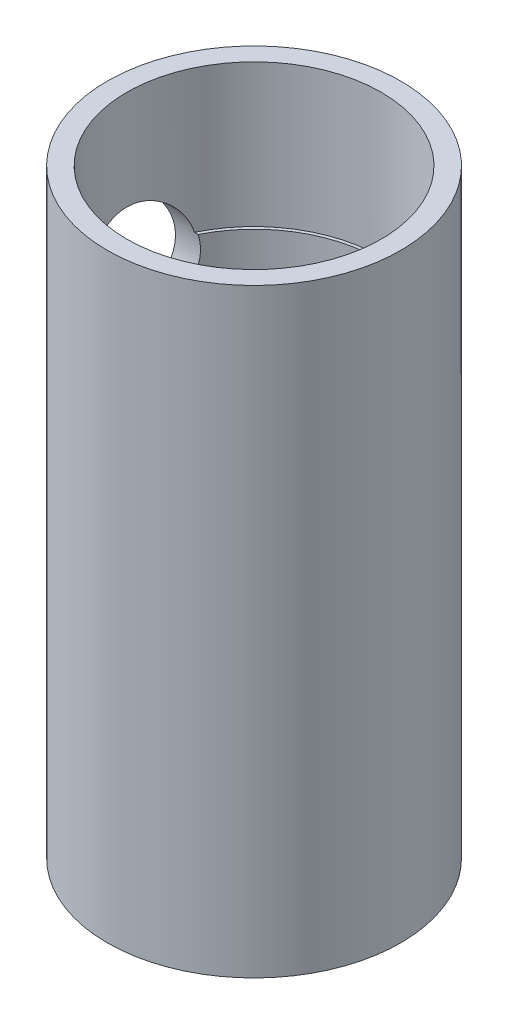
ISO-10303-21;
HEADER;
FILE_DESCRIPTION(('STEP AP214'),'2;1');
FILE_NAME('part.step','',(''),(''),'','','');
FILE_SCHEMA(('AUTOMOTIVE_DESIGN { 1 0 10303 214 1 1 1 1 }'));
ENDSEC;
DATA;
#1=APPLICATION_CONTEXT('core data for automotive mechanical design processes');
#2=APPLICATION_PROTOCOL_DEFINITION('international standard','automotive_design',2000,#1);
#3=PRODUCT_CONTEXT('',#1,'mechanical');
#4=PRODUCT('Part','Part','',(#3));
#5=PRODUCT_RELATED_PRODUCT_CATEGORY('part','',(#4));
#6=PRODUCT_DEFINITION_FORMATION('','',#4);
#7=PRODUCT_DEFINITION_CONTEXT('part definition',#1,'design');
#8=PRODUCT_DEFINITION('design','',#6,#7);
#9=PRODUCT_DEFINITION_SHAPE('','',#8);
#10=(LENGTH_UNIT() NAMED_UNIT(*) SI_UNIT(.MILLI.,.METRE.));
#11=(NAMED_UNIT(*) PLANE_ANGLE_UNIT() SI_UNIT($,.RADIAN.));
#12=(NAMED_UNIT(*) SI_UNIT($,.STERADIAN.) SOLID_ANGLE_UNIT());
#13=UNCERTAINTY_MEASURE_WITH_UNIT(LENGTH_MEASURE(1.E-05),#10,'distance_accuracy_value','');
#14=(GEOMETRIC_REPRESENTATION_CONTEXT(3) GLOBAL_UNCERTAINTY_ASSIGNED_CONTEXT((#13)) GLOBAL_UNIT_ASSIGNED_CONTEXT((#10,
#11,#12)) REPRESENTATION_CONTEXT('',''));
#15=CARTESIAN_POINT('',(0.,0.,0.));
#16=DIRECTION('',(0.,0.,1.));
#17=DIRECTION('',(1.,0.,0.));
#18=AXIS2_PLACEMENT_3D('',#15,#16,#17);
#19=CARTESIAN_POINT('',(0.,92.5,0.));
#20=DIRECTION('',(0.,-1.,0.));
#21=DIRECTION('',(0.,0.,-1.));
#22=AXIS2_PLACEMENT_3D('',#19,#20,#21);
#23=CYLINDRICAL_SURFACE('',#22,38.25);
#24=CARTESIAN_POINT('',(-34.2641941390718,48.5,17.0008088042893));
#25=CARTESIAN_POINT('',(-34.2381435848934,48.2849354779542,17.053307658475));
#26=CARTESIAN_POINT('',(-34.2139501900393,48.0686850927902,17.1017703815142));
#27=CARTESIAN_POINT('',(-34.1694481465527,47.6341120665675,17.1905149308626));
#28=CARTESIAN_POINT('',(-34.1491395748714,47.4157893845503,17.2307965951209));
#29=CARTESIAN_POINT('',(-34.0943033376247,46.7582367167698,17.3391939806238));
#30=CARTESIAN_POINT('',(-34.0658577161328,46.3163613613227,17.3948769432476));
#31=CARTESIAN_POINT('',(-34.0262278013022,45.4302944303113,17.4722693404018));
#32=CARTESIAN_POINT('',(-34.014990750002,44.9861141401189,17.4940826153484));
#33=CARTESIAN_POINT('',(-34.0099826794918,44.0973048101313,17.5038171775729));
#34=CARTESIAN_POINT('',(-34.016210190714,43.6526758112401,17.4917413164754));
#35=CARTESIAN_POINT('',(-34.0459345779966,42.765756573535,17.4338145053133));
#36=CARTESIAN_POINT('',(-34.0694491962198,42.3234692080585,17.3879288553609));
#37=CARTESIAN_POINT('',(-34.1329835449892,41.4448138791733,17.2628744296219));
#38=CARTESIAN_POINT('',(-34.1730042889734,41.0084462809243,17.1837036101966));
#39=CARTESIAN_POINT('',(-34.2682698028966,40.1445013582464,16.9929258414245));
#40=CARTESIAN_POINT('',(-34.3235170488628,39.7169254756272,16.8813136165217));
#41=CARTESIAN_POINT('',(-34.4475435978451,38.8732385977085,16.6267632834821));
#42=CARTESIAN_POINT('',(-34.5163230406553,38.4571277208988,16.4838248517285));
#43=CARTESIAN_POINT('',(-34.6667363889519,37.6315376158535,16.1651306656347));
#44=CARTESIAN_POINT('',(-34.7485727210965,37.2222989186612,15.9888482766277));
#45=CARTESIAN_POINT('',(-34.9219725410941,36.4199828887646,15.6064856014758));
#46=CARTESIAN_POINT('',(-35.0135392965897,36.0269110470224,15.4003952968805));
#47=CARTESIAN_POINT('',(-35.2040516835182,35.2587246783528,14.9597746127656));
#48=CARTESIAN_POINT('',(-35.3030001278675,34.8836170873327,14.7252333700046));
#49=CARTESIAN_POINT('',(-35.5058567589881,34.1531122381153,14.2291408484609));
#50=CARTESIAN_POINT('',(-35.6097652864978,33.7977163376698,13.9675877126269));
#51=CARTESIAN_POINT('',(-35.8311275063851,33.0722049803065,13.3902222747479));
#52=CARTESIAN_POINT('',(-35.9488648585861,32.7044111751399,13.0715960042441));
#53=CARTESIAN_POINT('',(-36.1843046752592,31.9967524573306,12.4049785893923));
#54=CARTESIAN_POINT('',(-36.3020071366213,31.6568773143975,12.0569982968926));
#55=CARTESIAN_POINT('',(-36.5344607320918,31.00658966723,11.3331480999331));
#56=CARTESIAN_POINT('',(-36.6492098810396,30.6961966217081,10.9572600634305));
#57=CARTESIAN_POINT('',(-36.8726927520938,30.1072056144364,10.179907041982));
#58=CARTESIAN_POINT('',(-36.9814288725541,29.8285949281678,9.77845239401758));
#59=CARTESIAN_POINT('',(-37.1938647235533,29.2956674646876,8.9372107724763));
#60=CARTESIAN_POINT('',(-37.2972460232827,29.042573234301,8.49656694811337));
#61=CARTESIAN_POINT('',(-37.4916875416269,28.5747212242354,7.59272813345202));
#62=CARTESIAN_POINT('',(-37.5827473129546,28.3599648361779,7.12953232531777));
#63=CARTESIAN_POINT('',(-37.7498444293093,27.9710781432407,6.18401797061164));
#64=CARTESIAN_POINT('',(-37.8258891329526,27.7969279303925,5.70170893094741));
#65=CARTESIAN_POINT('',(-37.9607035929183,27.4911335297655,4.72145580067361));
#66=CARTESIAN_POINT('',(-38.0194749640292,27.3594853685916,4.22351317638151));
#67=CARTESIAN_POINT('',(-38.1143676489956,27.1482341474891,3.25240313375543));
#68=CARTESIAN_POINT('',(-38.1518140468948,27.0655687515312,2.78002976803506));
#69=CARTESIAN_POINT('',(-38.2092129443408,26.9392378759796,1.82904354982571));
#70=CARTESIAN_POINT('',(-38.2291662712299,26.8955705519537,1.3504309935086));
#71=CARTESIAN_POINT('',(-38.2510106768318,26.8477782069746,0.39098625475133));
#72=CARTESIAN_POINT('',(-38.2529078172102,26.8436399156774,-0.0898451285645744));
#73=CARTESIAN_POINT('',(-38.2386008057896,26.8749237012639,-1.0499393157405));
#74=CARTESIAN_POINT('',(-38.2223972591985,26.910344455466,-1.52920217150788));
#75=CARTESIAN_POINT('',(-38.1739532384048,27.0167870428658,-2.45182127379952));
#76=CARTESIAN_POINT('',(-38.1428025818588,27.0853917843811,-2.89551656590489));
#77=CARTESIAN_POINT('',(-38.0658137103129,27.2561566037183,-3.77507582412566));
#78=CARTESIAN_POINT('',(-38.0199762702756,27.3583149110602,-4.21094020216573));
#79=CARTESIAN_POINT('',(-37.9147055894478,27.5951903216102,-5.07205990229719));
#80=CARTESIAN_POINT('',(-37.8552714777882,27.7299095103793,-5.49731454289734));
#81=CARTESIAN_POINT('',(-37.724187426682,28.0306823545084,-6.33465028591056));
#82=CARTESIAN_POINT('',(-37.65253701193,28.1967372290869,-6.74673087501375));
#83=CARTESIAN_POINT('',(-37.4963864340642,28.5640906181402,-7.56722906376009));
#84=CARTESIAN_POINT('',(-37.4115726593048,28.7662751614723,-7.97518997425803));
#85=CARTESIAN_POINT('',(-37.2326667858936,29.200803038743,-8.77257159703507));
#86=CARTESIAN_POINT('',(-37.1385745884722,29.4331466937363,-9.1619921118847));
#87=CARTESIAN_POINT('',(-36.9432040768317,29.9264386839699,-9.920462389794));
#88=CARTESIAN_POINT('',(-36.8419244682634,30.1873921760634,-10.2895084623263));
#89=CARTESIAN_POINT('',(-36.6343879472974,30.7363862271596,-11.0055969343031));
#90=CARTESIAN_POINT('',(-36.5281291107501,31.0244373016776,-11.3526307034381));
#91=CARTESIAN_POINT('',(-36.3038844379294,31.6514822562194,-12.0514007554351));
#92=CARTESIAN_POINT('',(-36.185667327808,31.9927243815419,-12.4010483415857));
#93=CARTESIAN_POINT('',(-35.9492358333471,32.7032290000104,-13.0706172093886));
#94=CARTESIAN_POINT('',(-35.8310214491907,33.0724923188239,-13.3905376144867));
#95=CARTESIAN_POINT('',(-35.5977296042384,33.8372236754821,-13.9989407114712));
#96=CARTESIAN_POINT('',(-35.4826531892806,34.2327003027419,-14.2874130159301));
#97=CARTESIAN_POINT('',(-35.2589048929774,35.047772414233,-14.8309997173997));
#98=CARTESIAN_POINT('',(-35.1502339838505,35.4673715407497,-15.0861090577515));
#99=CARTESIAN_POINT('',(-34.9393673629489,36.3417321055678,-15.5683824467248));
#100=CARTESIAN_POINT('',(-34.8374756303952,36.7971795166681,-15.7944389557166));
#101=CARTESIAN_POINT('',(-34.6475454313125,37.7282604543039,-16.2068398948384));
#102=CARTESIAN_POINT('',(-34.5595003893526,38.2038842625157,-16.3932031892248));
#103=CARTESIAN_POINT('',(-34.4005134627231,39.1720921357527,-16.7242618329952));
#104=CARTESIAN_POINT('',(-34.3295671598624,39.6646717818354,-16.8689679481781));
#105=CARTESIAN_POINT('',(-34.2076240679525,40.6629581013979,-17.1149020294832));
#106=CARTESIAN_POINT('',(-34.1566241234102,41.1686626850171,-17.2161368729638));
#107=CARTESIAN_POINT('',(-34.0801897971872,42.1448103002928,-17.3669123065925));
#108=CARTESIAN_POINT('',(-34.0529327501744,42.6145418657875,-17.4201523652447));
#109=CARTESIAN_POINT('',(-34.0179144579244,43.5575658098823,-17.4884391329691));
#110=CARTESIAN_POINT('',(-34.010154879679,44.0308584894805,-17.5034825763138));
#111=CARTESIAN_POINT('',(-34.0144311694162,44.9762367631149,-17.495170153445));
#112=CARTESIAN_POINT('',(-34.0264355124444,45.4483230788278,-17.4718754395241));
#113=CARTESIAN_POINT('',(-34.0697198385377,46.3879762786799,-17.3873217187934));
#114=CARTESIAN_POINT('',(-34.100988510702,46.8555456514072,-17.3260849892227));
#115=CARTESIAN_POINT('',(-34.1585584494719,47.5176350763709,-17.2121116657303));
#116=CARTESIAN_POINT('',(-34.1774908392059,47.7155312439865,-17.1745079542443));
#117=CARTESIAN_POINT('',(-34.2185092300184,48.1092723068575,-17.0926362884327));
#118=CARTESIAN_POINT('',(-34.2405900559208,48.3051200131082,-17.0483792639901));
#119=CARTESIAN_POINT('',(-34.2641941390718,48.5,-17.0008088042893));
#120=B_SPLINE_CURVE_WITH_KNOTS('',3,(#24,#25,#26,#27,#28,#29,#30,#31,#32,#33,#34,#35,#36,#37,
#38,#39,#40,#41,#42,#43,#44,#45,#46,#47,#48,#49,#50,#51,#52,#53,#54,#55,#56,#57,#58,#59,#60,#61,
#62,#63,#64,#65,#66,#67,#68,#69,#70,#71,#72,#73,#74,#75,#76,#77,#78,#79,#80,#81,#82,#83,#84,#85,
#86,#87,#88,#89,#90,#91,#92,#93,#94,#95,#96,#97,#98,#99,#100,#101,#102,#103,#104,#105,#106,#107,
#108,#109,#110,#111,#112,#113,#114,#115,#116,#117,#118,#119),.UNSPECIFIED.,.F.,.F.,(4,2,2,2,2,2,
2,2,2,2,2,2,2,2,2,2,2,2,2,2,2,2,2,2,2,2,2,2,2,2,2,2,2,2,2,2,2,2,2,2,2,2,2,2,2,2,2,4),(0.,
0.668624185006783,1.33726161285922,2.67434813861644,4.00732716524454,5.34019403079537,
6.67443076194051,8.00874942435118,9.34328519247991,10.6778347477381,12.0355522387374,
13.3937271240389,14.7524222346864,16.11121081706,17.6115088712097,19.1112546927625,
20.6119835934538,22.1121095314822,23.6657956600238,25.2195381742038,26.7725173265876,
28.3253512533266,29.7664959521713,31.207572487785,32.6481652206734,34.0887097878787,
35.4372914295982,36.7858019237924,38.1343988145036,39.483048187664,40.8709989422968,
42.2589644733725,43.6471805944283,45.0359376679571,46.5422543513417,48.0486154368329,
49.5554725811596,51.0625578483159,52.6162275358085,54.1691571838055,55.7216851347007,
57.2739673778463,58.692640322139,60.1114345557986,61.5279678967541,62.943670322774,
63.550528057953,64.1563995427988),.UNSPECIFIED.);
#121=CARTESIAN_POINT('',(-34.2641941390718,48.5,17.0008088042893));
#122=VERTEX_POINT('',#121);
#123=CARTESIAN_POINT('',(-34.2641941390718,48.5,-17.0008088042893));
#124=VERTEX_POINT('',#123);
#125=EDGE_CURVE('E54',#122,#124,#120,.T.);
#126=ORIENTED_EDGE('',*,*,#125,.F.);
#127=CARTESIAN_POINT('',(0.,48.5,0.));
#128=DIRECTION('',(0.,1.,0.));
#129=DIRECTION('',(0.,0.,1.));
#130=AXIS2_PLACEMENT_3D('',#127,#128,#129);
#131=CIRCLE('',#130,38.25);
#132=EDGE_CURVE('E85',#122,#124,#131,.T.);
#133=ORIENTED_EDGE('',*,*,#132,.T.);
#134=EDGE_LOOP('',(#126,#133));
#135=FACE_BOUND('',#134,.T.);
#136=CARTESIAN_POINT('',(0.,13.85,0.));
#137=DIRECTION('',(0.,-1.,0.));
#138=DIRECTION('',(0.,0.,-1.));
#139=AXIS2_PLACEMENT_3D('',#136,#137,#138);
#140=CIRCLE('',#139,38.25);
#141=CARTESIAN_POINT('',(0.,13.85,-38.25));
#142=VERTEX_POINT('',#141);
#143=EDGE_CURVE('E91',#142,#142,#140,.T.);
#144=ORIENTED_EDGE('',*,*,#143,.T.);
#145=EDGE_LOOP('',(#144));
#146=FACE_BOUND('',#145,.T.);
#147=ADVANCED_FACE('F39',(#135,#146),#23,.F.);
#148=CARTESIAN_POINT('',(0.,92.5,0.));
#149=DIRECTION('',(0.,1.,0.));
#150=DIRECTION('',(0.,0.,1.));
#151=AXIS2_PLACEMENT_3D('',#148,#149,#150);
#152=PLANE('',#151);
#153=CARTESIAN_POINT('',(0.,92.5,0.));
#154=DIRECTION('',(0.,1.,0.));
#155=DIRECTION('',(0.,0.,1.));
#156=AXIS2_PLACEMENT_3D('',#153,#154,#155);
#157=CIRCLE('',#156,39.25);
#158=CARTESIAN_POINT('',(0.,92.5,39.25));
#159=VERTEX_POINT('',#158);
#160=EDGE_CURVE('E79',#159,#159,#157,.T.);
#161=ORIENTED_EDGE('',*,*,#160,.F.);
#162=EDGE_LOOP('',(#161));
#163=FACE_BOUND('',#162,.T.);
#164=CARTESIAN_POINT('',(0.,92.5,0.));
#165=DIRECTION('',(0.,1.,0.));
#166=DIRECTION('',(0.,0.,1.));
#167=AXIS2_PLACEMENT_3D('',#164,#165,#166);
#168=CIRCLE('',#167,45.25);
#169=CARTESIAN_POINT('',(0.,92.5,45.25));
#170=VERTEX_POINT('',#169);
#171=EDGE_CURVE('E99',#170,#170,#168,.T.);
#172=ORIENTED_EDGE('',*,*,#171,.T.);
#173=EDGE_LOOP('',(#172));
#174=FACE_BOUND('',#173,.T.);
#175=ADVANCED_FACE('F118',(#163,#174),#152,.T.);
#176=CARTESIAN_POINT('',(0.,-92.5,0.));
#177=DIRECTION('',(0.,1.,0.));
#178=DIRECTION('',(0.,0.,1.));
#179=AXIS2_PLACEMENT_3D('',#176,#177,#178);
#180=PLANE('',#179);
#181=CARTESIAN_POINT('',(0.,-92.5,0.));
#182=DIRECTION('',(0.,1.,0.));
#183=DIRECTION('',(0.,0.,1.));
#184=AXIS2_PLACEMENT_3D('',#181,#182,#183);
#185=CIRCLE('',#184,45.25);
#186=CARTESIAN_POINT('',(0.,-92.5,45.25));
#187=VERTEX_POINT('',#186);
#188=EDGE_CURVE('E98',#187,#187,#185,.T.);
#189=ORIENTED_EDGE('',*,*,#188,.F.);
#190=EDGE_LOOP('',(#189));
#191=FACE_BOUND('',#190,.T.);
#192=CARTESIAN_POINT('',(0.,-92.5,0.));
#193=DIRECTION('',(0.,1.,0.));
#194=DIRECTION('',(0.,0.,1.));
#195=AXIS2_PLACEMENT_3D('',#192,#193,#194);
#196=CIRCLE('',#195,38.25);
#197=CARTESIAN_POINT('',(0.,-92.5,38.25));
#198=VERTEX_POINT('',#197);
#199=EDGE_CURVE('E95',#198,#198,#196,.T.);
#200=ORIENTED_EDGE('',*,*,#199,.T.);
#201=EDGE_LOOP('',(#200));
#202=FACE_BOUND('',#201,.T.);
#203=ADVANCED_FACE('F116',(#191,#202),#180,.F.);
#204=CARTESIAN_POINT('',(0.,92.5,0.));
#205=DIRECTION('',(0.,-1.,0.));
#206=DIRECTION('',(0.,0.,-1.));
#207=AXIS2_PLACEMENT_3D('',#204,#205,#206);
#208=CYLINDRICAL_SURFACE('',#207,45.25);
#209=CARTESIAN_POINT('',(-45.25,26.85,0.));
#210=CARTESIAN_POINT('',(-45.2500021885297,26.8499970724663,-0.472775029653615));
#211=CARTESIAN_POINT('',(-45.2425750329907,26.8691727907454,-0.945511062382879));
#212=CARTESIAN_POINT('',(-45.2130752570356,26.9456631794411,-1.88739038742202));
#213=CARTESIAN_POINT('',(-45.1910042238609,27.002973716449,-2.35653406353131));
#214=CARTESIAN_POINT('',(-45.1328171267814,27.1551284872674,-3.2876927777358));
#215=CARTESIAN_POINT('',(-45.0967040093148,27.2499648471411,-3.74970929018704));
#216=CARTESIAN_POINT('',(-45.0113901039774,27.4762419479669,-4.66345749003758));
#217=CARTESIAN_POINT('',(-44.9621888908118,27.6076838784151,-5.11518884270505));
#218=CARTESIAN_POINT('',(-44.85209139633,27.9056479604327,-6.00439106127881));
#219=CARTESIAN_POINT('',(-44.7912194953244,28.0720970503995,-6.44188946983718));
#220=CARTESIAN_POINT('',(-44.6592534001976,28.4388193771777,-7.30085038680852));
#221=CARTESIAN_POINT('',(-44.5881592994219,28.6390923051241,-7.72231304161008));
#222=CARTESIAN_POINT('',(-44.4374967415803,29.0719187892832,-8.54675474442629));
#223=CARTESIAN_POINT('',(-44.3579278069201,29.3044741649787,-8.9497327489165));
#224=CARTESIAN_POINT('',(-44.1922124207111,29.8003009781726,-9.73509172745375));
#225=CARTESIAN_POINT('',(-44.1060635942391,30.0635835245062,-10.117465178826));
#226=CARTESIAN_POINT('',(-43.9257136272923,30.6302758651633,-10.8743530874437));
#227=CARTESIAN_POINT('',(-43.8313280514449,30.9348724986367,-11.2479353117471));
#228=CARTESIAN_POINT('',(-43.6401104745241,31.5734769653652,-11.9683831345773));
#229=CARTESIAN_POINT('',(-43.5432784041044,31.9074856329789,-12.3152479746636));
#230=CARTESIAN_POINT('',(-43.3496266674953,32.603116861587,-12.9804640805373));
#231=CARTESIAN_POINT('',(-43.2528070305861,32.9647528611987,-13.2988013040747));
#232=CARTESIAN_POINT('',(-43.0618199226586,33.713330190042,-13.9047862152989));
#233=CARTESIAN_POINT('',(-42.9676515710733,34.1002629722039,-14.1924441830864));
#234=CARTESIAN_POINT('',(-42.7807148363524,34.9138894611653,-14.7465917504682));
#235=CARTESIAN_POINT('',(-42.6881650996099,35.3415654813409,-15.0117154343898));
#236=CARTESIAN_POINT('',(-42.5115525694155,36.2195345867324,-15.5048064697048));
#237=CARTESIAN_POINT('',(-42.4274900672883,36.6698284475129,-15.7327725458264));
#238=CARTESIAN_POINT('',(-42.2706240459597,37.5899314436047,-16.1495025555317));
#239=CARTESIAN_POINT('',(-42.1978167625793,38.0597339874863,-16.3382796027103));
#240=CARTESIAN_POINT('',(-42.0659443076269,39.01566151633,-16.6748779305091));
#241=CARTESIAN_POINT('',(-42.0068782717698,39.5017854725203,-16.8227017870791));
#242=CARTESIAN_POINT('',(-41.906834564133,40.4654230819322,-17.0703481162157));
#243=CARTESIAN_POINT('',(-41.8651877351165,40.9424066774596,-17.1719628700906));
#244=CARTESIAN_POINT('',(-41.7978926666525,41.9043017444539,-17.3351230356146));
#245=CARTESIAN_POINT('',(-41.7722439933058,42.3892130005421,-17.39666953399));
#246=CARTESIAN_POINT('',(-41.7378754610645,43.3628976998094,-17.478965925587));
#247=CARTESIAN_POINT('',(-41.7291490873352,43.8516695839092,-17.4997315188923));
#248=CARTESIAN_POINT('',(-41.7289264051625,44.8292290354253,-17.5002632688134));
#249=CARTESIAN_POINT('',(-41.737429367628,45.3180166013028,-17.4800311603226));
#250=CARTESIAN_POINT('',(-41.7702542062337,46.2602090645642,-17.4014367030764));
#251=CARTESIAN_POINT('',(-41.7935220732358,46.7138654176095,-17.3456138666866));
#252=CARTESIAN_POINT('',(-41.8541218878434,47.6144860489352,-17.1988742576193));
#253=CARTESIAN_POINT('',(-41.8914531401177,48.0614506569375,-17.1079592199881));
#254=CARTESIAN_POINT('',(-41.9790416830216,48.9457692083949,-16.8918951637543));
#255=CARTESIAN_POINT('',(-42.029300440242,49.3831220553068,-16.7667422608549));
#256=CARTESIAN_POINT('',(-42.1412626636679,50.2454502771529,-16.4833149838404));
#257=CARTESIAN_POINT('',(-42.202966524006,50.6704252252488,-16.325039469065));
#258=CARTESIAN_POINT('',(-42.3373897498871,51.5137100913286,-15.9732294253901));
#259=CARTESIAN_POINT('',(-42.4103012508063,51.93172629096,-15.7790648404894));
#260=CARTESIAN_POINT('',(-42.5641946532756,52.7499805687986,-15.3590957642885));
#261=CARTESIAN_POINT('',(-42.6451765935744,53.1502185616336,-15.1332911210723));
#262=CARTESIAN_POINT('',(-42.813080370851,53.9308500521976,-14.6515425466861));
#263=CARTESIAN_POINT('',(-42.9000027019817,54.3112418943669,-14.3955961068794));
#264=CARTESIAN_POINT('',(-43.0776277446887,55.0503876947285,-13.8550156171755));
#265=CARTESIAN_POINT('',(-43.1683321886364,55.4091315489434,-13.5703683344865));
#266=CARTESIAN_POINT('',(-43.3578633189016,56.1279674429742,-12.9526026413421));
#267=CARTESIAN_POINT('',(-43.4568050153043,56.4863011110711,-12.6174705612019));
#268=CARTESIAN_POINT('',(-43.6537267900174,57.1735616970169,-11.9183246904511));
#269=CARTESIAN_POINT('',(-43.7517072374168,57.5025003292194,-11.5543225151419));
#270=CARTESIAN_POINT('',(-43.9441701090684,58.1292078154392,-10.7992699576997));
#271=CARTESIAN_POINT('',(-44.0386511007872,58.4269639938262,-10.4082086825221));
#272=CARTESIAN_POINT('',(-44.221551396791,58.9891176489263,-9.60145535980729));
#273=CARTESIAN_POINT('',(-44.309970735619,59.2535153157443,-9.18576345265609));
#274=CARTESIAN_POINT('',(-44.4798399352336,59.7512779710322,-8.3247927121799));
#275=CARTESIAN_POINT('',(-44.5611410830241,59.9840202420987,-7.87912390889937));
#276=CARTESIAN_POINT('',(-44.7126960317769,60.4109003793548,-6.9678288693416));
#277=CARTESIAN_POINT('',(-44.7829496094031,60.6050374651287,-6.50220222984186));
#278=CARTESIAN_POINT('',(-44.9103387692485,60.9527771330328,-5.55449797709507));
#279=CARTESIAN_POINT('',(-44.9674793742348,61.106395238852,-5.07242674429833));
#280=CARTESIAN_POINT('',(-45.0669672187817,61.3715794385363,-4.09536615800312));
#281=CARTESIAN_POINT('',(-45.1093154074144,61.4831482302949,-3.60037763546049));
#282=CARTESIAN_POINT('',(-45.1760072533689,61.6579538455963,-2.62949335741842));
#283=CARTESIAN_POINT('',(-45.2012264931328,61.7235477379718,-2.15408105447229));
#284=CARTESIAN_POINT('',(-45.2366381772575,61.8154730022657,-1.19892265315528));
#285=CARTESIAN_POINT('',(-45.2468311827098,61.8418058402234,-0.719176717278757));
#286=CARTESIAN_POINT('',(-45.2519046535815,61.854925263797,0.240833703196402));
#287=CARTESIAN_POINT('',(-45.2467883147537,61.8417201027815,0.72109805865621));
#288=CARTESIAN_POINT('',(-45.2213932677111,61.7759241310109,1.67851048497618));
#289=CARTESIAN_POINT('',(-45.2011148170509,61.7233339892776,2.15565860863203));
#290=CARTESIAN_POINT('',(-45.147108080941,61.5823214863416,3.08352086761996));
#291=CARTESIAN_POINT('',(-45.1139725929151,61.4954759512701,3.53451050190263));
#292=CARTESIAN_POINT('',(-45.0351313188425,61.2869379317429,4.42721443100878));
#293=CARTESIAN_POINT('',(-44.9894259700216,61.1652466593434,4.8689290478762));
#294=CARTESIAN_POINT('',(-44.8865696919572,60.8880829518561,5.74028411159364));
#295=CARTESIAN_POINT('',(-44.8294178386715,60.732607789409,6.1699235804577));
#296=CARTESIAN_POINT('',(-44.7050501237424,60.389158869911,7.01450081691042));
#297=CARTESIAN_POINT('',(-44.6378339222003,60.2011840152291,7.42943808738266));
#298=CARTESIAN_POINT('',(-44.4927787771655,59.7880497966025,8.25444004520602));
#299=CARTESIAN_POINT('',(-44.414681726473,59.5619443911138,8.66398547496328));
#300=CARTESIAN_POINT('',(-44.2514055887889,59.0784136527847,9.46265128434076));
#301=CARTESIAN_POINT('',(-44.1662264040105,58.8209878874646,9.85177138181654));
#302=CARTESIAN_POINT('',(-43.9908258481978,58.2764743545182,10.6075574983715));
#303=CARTESIAN_POINT('',(-43.900603651754,57.9893817246348,10.9742198209944));
#304=CARTESIAN_POINT('',(-43.7172605483149,57.387202145508,11.6832264838801));
#305=CARTESIAN_POINT('',(-43.6241386160911,57.0721052203749,12.0255620795223));
#306=CARTESIAN_POINT('',(-43.4315035543794,56.3955189533125,12.7042905577987));
#307=CARTESIAN_POINT('',(-43.3319502070071,56.0323673095043,13.0390171909026));
#308=CARTESIAN_POINT('',(-43.1348766741448,55.2787394942288,13.6768554153215));
#309=CARTESIAN_POINT('',(-43.0373566040088,54.888261777916,13.9799652168018));
#310=CARTESIAN_POINT('',(-42.8470946667598,54.0821346158811,14.5526657530505));
#311=CARTESIAN_POINT('',(-42.7543544120067,53.6664767777598,14.8222452199179));
#312=CARTESIAN_POINT('',(-42.5764766438343,52.8127450477957,15.3257111175487));
#313=CARTESIAN_POINT('',(-42.4913360846036,52.3746802479676,15.5596118745378));
#314=CARTESIAN_POINT('',(-42.3307244067409,51.4756317712162,15.9914270468226));
#315=CARTESIAN_POINT('',(-42.2553235044448,51.0145116774695,16.1890840323338));
#316=CARTESIAN_POINT('',(-42.1174019152043,50.0752742258871,16.5445867863907));
#317=CARTESIAN_POINT('',(-42.054881370109,49.5971566809295,16.7024321165019));
#318=CARTESIAN_POINT('',(-41.9449611368297,48.6277339390011,16.9765889318281));
#319=CARTESIAN_POINT('',(-41.897552941446,48.1364363309721,17.0929237889653));
#320=CARTESIAN_POINT('',(-41.8195695485565,47.1443385455984,17.2828438683836));
#321=CARTESIAN_POINT('',(-41.7889930704398,46.6435390941844,17.3564323429703));
#322=CARTESIAN_POINT('',(-41.7473046089063,45.6709022101134,17.4564530584069));
#323=CARTESIAN_POINT('',(-41.7350116945657,45.1994078150352,17.4857485699635));
#324=CARTESIAN_POINT('',(-41.7264753781084,44.2554593048117,17.5061101350843));
#325=CARTESIAN_POINT('',(-41.7302312171798,43.7830052360971,17.4971779961158));
#326=CARTESIAN_POINT('',(-41.7536625310758,42.8408166968019,17.4411889467292));
#327=CARTESIAN_POINT('',(-41.7733363824131,42.371081953796,17.3941359242816));
#328=CARTESIAN_POINT('',(-41.8279364700103,41.4378217971669,17.2624244573075));
#329=CARTESIAN_POINT('',(-41.8628626704378,40.9742963689588,17.1777661011272));
#330=CARTESIAN_POINT('',(-41.9453594399293,40.0727082407233,16.9753000078465));
#331=CARTESIAN_POINT('',(-41.9924501074862,39.6343197059633,16.8587421276024));
#332=CARTESIAN_POINT('',(-42.0983763588057,38.769219942156,16.5924597076389));
#333=CARTESIAN_POINT('',(-42.1572115769974,38.3425083501122,16.4427362002452));
#334=CARTESIAN_POINT('',(-42.284968939194,37.5032374894739,16.1113441889723));
#335=CARTESIAN_POINT('',(-42.3538914299125,37.0906787079331,15.9296745870184));
#336=CARTESIAN_POINT('',(-42.4999949688499,36.2818284439808,15.5356708430208));
#337=CARTESIAN_POINT('',(-42.577179008543,35.88554292641,15.3233255836459));
#338=CARTESIAN_POINT('',(-42.7421991369656,35.0902725900915,14.8570303341834));
#339=CARTESIAN_POINT('',(-42.8303866722918,34.6923207354647,14.6014422353718));
#340=CARTESIAN_POINT('',(-43.0113396825596,33.9190759387072,14.0594722025688));
#341=CARTESIAN_POINT('',(-43.1041053050515,33.5437837277582,13.7730892757178));
#342=CARTESIAN_POINT('',(-43.291840811712,32.8176956086136,13.1711215051021));
#343=CARTESIAN_POINT('',(-43.3868116673602,32.4669107803928,12.8555236010299));
#344=CARTESIAN_POINT('',(-43.5764863123595,31.7920336879218,12.1971170683899));
#345=CARTESIAN_POINT('',(-43.6711901748715,31.4679332465841,11.8543168393348));
#346=CARTESIAN_POINT('',(-43.8635562189608,30.8297536794102,11.1221633805077));
#347=CARTESIAN_POINT('',(-43.9610608963655,30.5174079706005,10.7312550774876));
#348=CARTESIAN_POINT('',(-44.1504736717473,29.9267515013251,9.92322327594545));
#349=CARTESIAN_POINT('',(-44.2423816302029,29.6484415891685,9.50609912441106));
#350=CARTESIAN_POINT('',(-44.4180615659591,29.1279191320076,8.64812386396889));
#351=CARTESIAN_POINT('',(-44.5018317806251,28.8857144013365,8.20726764669292));
#352=CARTESIAN_POINT('',(-44.6588430558666,28.4395196664798,7.30479419890283));
#353=CARTESIAN_POINT('',(-44.7320837190136,28.235531104641,6.84317618561633));
#354=CARTESIAN_POINT('',(-44.8706228443891,27.8547283706339,5.869261751504));
#355=CARTESIAN_POINT('',(-44.9349991522261,27.6808383703772,5.3556854478366));
#356=CARTESIAN_POINT('',(-45.0470498290719,27.3811007628815,4.31286465680332));
#357=CARTESIAN_POINT('',(-45.094722904301,27.255256877075,3.78361895917748));
#358=CARTESIAN_POINT('',(-45.1716733165588,27.0532865284425,2.71466645990027));
#359=CARTESIAN_POINT('',(-45.2009597512714,26.9771354769355,2.17496496825408));
#360=CARTESIAN_POINT('',(-45.2401203683376,26.8754977188282,1.09015782232332));
#361=CARTESIAN_POINT('',(-45.2499974768874,26.8500033750958,0.54505299511458));
#362=CARTESIAN_POINT('',(-45.25,26.85,0.));
#363=B_SPLINE_CURVE_WITH_KNOTS('',3,(#209,#210,#211,#212,#213,#214,#215,#216,#217,#218,#219,
#220,#221,#222,#223,#224,#225,#226,#227,#228,#229,#230,#231,#232,#233,#234,#235,#236,#237,#238,
#239,#240,#241,#242,#243,#244,#245,#246,#247,#248,#249,#250,#251,#252,#253,#254,#255,#256,#257,
#258,#259,#260,#261,#262,#263,#264,#265,#266,#267,#268,#269,#270,#271,#272,#273,#274,#275,#276,
#277,#278,#279,#280,#281,#282,#283,#284,#285,#286,#287,#288,#289,#290,#291,#292,#293,#294,#295,
#296,#297,#298,#299,#300,#301,#302,#303,#304,#305,#306,#307,#308,#309,#310,#311,#312,#313,#314,
#315,#316,#317,#318,#319,#320,#321,#322,#323,#324,#325,#326,#327,#328,#329,#330,#331,#332,#333,
#334,#335,#336,#337,#338,#339,#340,#341,#342,#343,#344,#345,#346,#347,#348,#349,#350,#351,#352,
#353,#354,#355,#356,#357,#358,#359,#360,#361,#362),.UNSPECIFIED.,.T.,.F.,(4,2,2,2,2,2,2,2,2,2,2,
2,2,2,2,2,2,2,2,2,2,2,2,2,2,2,2,2,2,2,2,2,2,2,2,2,2,2,2,2,2,2,2,2,2,2,2,2,2,2,2,2,2,2,2,2,2,2,2,
2,2,2,2,2,2,2,2,2,2,2,2,2,2,2,2,2,4),(0.,1.41781302506244,2.83547239930154,4.25283446770663,
5.67024259859583,7.08472137654578,8.49918723877736,9.91373285462397,11.328791466546,
12.8006756788967,14.2726016590139,15.7452482358146,17.2173997928862,18.7503841918487,
20.2834211926964,21.8159443725128,23.3483711349507,24.8148363067272,26.2812617035645,
27.7471224361754,29.2129211394805,30.584321864567,31.9556547928476,33.3271433638519,
34.698679173281,36.0970868152777,37.4955011717992,38.8940319976932,40.2932106036621,
41.7930107709478,43.2922105553004,44.7920174161752,46.2918157294995,47.8178111285914,
49.3438373730106,50.869278112075,52.3946209618484,53.834529358939,55.2743839873502,
56.7139380739346,58.153467707766,59.5332849513505,60.9130542059084,62.2929348900679,
63.6728621868485,65.0941704523328,66.5154983458347,67.9370595587642,69.3591292157999,
70.8688328009568,72.3786218043813,73.8889168108528,75.3986037766194,76.9186301001914,
78.438673162649,79.9578590294802,81.476929295791,82.892828714484,84.3086611878224,
85.7243492777802,87.140034041877,88.5066802755551,89.8732839764686,91.2399346604794,
92.6070818881603,94.0488401496611,95.4906449090056,96.9330973565891,98.3751061251278,
99.9026098561062,101.430151650868,102.95802357674,104.485953155627,106.121451571737,
107.757076640394,109.391891764905,111.026460401892),.UNSPECIFIED.);
#364=CARTESIAN_POINT('',(-45.25,26.85,0.));
#365=VERTEX_POINT('',#364);
#366=EDGE_CURVE('E142',#365,#365,#363,.T.);
#367=ORIENTED_EDGE('',*,*,#366,.T.);
#368=EDGE_LOOP('',(#367));
#369=FACE_BOUND('',#368,.T.);
#370=ORIENTED_EDGE('',*,*,#171,.F.);
#371=EDGE_LOOP('',(#370));
#372=FACE_BOUND('',#371,.T.);
#373=ORIENTED_EDGE('',*,*,#188,.T.);
#374=EDGE_LOOP('',(#373));
#375=FACE_BOUND('',#374,.T.);
#376=ADVANCED_FACE('F41',(#369,#372,#375),#208,.T.);
#377=CARTESIAN_POINT('',(0.,-86.15,0.));
#378=DIRECTION('',(0.,-1.,0.));
#379=DIRECTION('',(0.,0.,-1.));
#380=AXIS2_PLACEMENT_3D('',#377,#378,#379);
#381=CIRCLE('',#380,38.25);
#382=CARTESIAN_POINT('',(0.,-86.15,-38.25));
#383=VERTEX_POINT('',#382);
#384=EDGE_CURVE('E70',#383,#383,#381,.T.);
#385=ORIENTED_EDGE('',*,*,#384,.F.);
#386=EDGE_LOOP('',(#385));
#387=FACE_BOUND('',#386,.T.);
#388=ORIENTED_EDGE('',*,*,#199,.F.);
#389=EDGE_LOOP('',(#388));
#390=FACE_BOUND('',#389,.T.);
#391=ADVANCED_FACE('F109',(#387,#390),#23,.F.);
#392=CARTESIAN_POINT('',(0.,13.85,0.));
#393=DIRECTION('',(0.,-1.,0.));
#394=DIRECTION('',(0.,0.,-1.));
#395=AXIS2_PLACEMENT_3D('',#392,#393,#394);
#396=PLANE('',#395);
#397=CARTESIAN_POINT('',(0.,13.85,0.));
#398=DIRECTION('',(0.,-1.,0.));
#399=DIRECTION('',(0.,0.,-1.));
#400=AXIS2_PLACEMENT_3D('',#397,#398,#399);
#401=CIRCLE('',#400,36.25);
#402=CARTESIAN_POINT('',(0.,13.85,-36.25));
#403=VERTEX_POINT('',#402);
#404=EDGE_CURVE('E82',#403,#403,#401,.T.);
#405=ORIENTED_EDGE('',*,*,#404,.T.);
#406=EDGE_LOOP('',(#405));
#407=FACE_BOUND('',#406,.T.);
#408=ORIENTED_EDGE('',*,*,#143,.F.);
#409=EDGE_LOOP('',(#408));
#410=FACE_BOUND('',#409,.T.);
#411=ADVANCED_FACE('F112',(#407,#410),#396,.F.);
#412=CARTESIAN_POINT('',(0.,-86.15,0.));
#413=DIRECTION('',(0.,-1.,0.));
#414=DIRECTION('',(0.,0.,-1.));
#415=AXIS2_PLACEMENT_3D('',#412,#413,#414);
#416=PLANE('',#415);
#417=CARTESIAN_POINT('',(0.,-86.15,0.));
#418=DIRECTION('',(0.,-1.,0.));
#419=DIRECTION('',(0.,0.,-1.));
#420=AXIS2_PLACEMENT_3D('',#417,#418,#419);
#421=CIRCLE('',#420,36.25);
#422=CARTESIAN_POINT('',(0.,-86.15,-36.25));
#423=VERTEX_POINT('',#422);
#424=EDGE_CURVE('E78',#423,#423,#421,.T.);
#425=ORIENTED_EDGE('',*,*,#424,.F.);
#426=EDGE_LOOP('',(#425));
#427=FACE_BOUND('',#426,.T.);
#428=ORIENTED_EDGE('',*,*,#384,.T.);
#429=EDGE_LOOP('',(#428));
#430=FACE_BOUND('',#429,.T.);
#431=ADVANCED_FACE('F107',(#427,#430),#416,.T.);
#432=CARTESIAN_POINT('',(0.,13.85,0.));
#433=DIRECTION('',(0.,-1.,0.));
#434=DIRECTION('',(0.,0.,-1.));
#435=AXIS2_PLACEMENT_3D('',#432,#433,#434);
#436=CYLINDRICAL_SURFACE('',#435,36.25);
#437=ORIENTED_EDGE('',*,*,#404,.F.);
#438=EDGE_LOOP('',(#437));
#439=FACE_BOUND('',#438,.T.);
#440=ORIENTED_EDGE('',*,*,#424,.T.);
#441=EDGE_LOOP('',(#440));
#442=FACE_BOUND('',#441,.T.);
#443=ADVANCED_FACE('F160',(#439,#442),#436,.F.);
#444=CARTESIAN_POINT('',(0.,48.5,0.));
#445=DIRECTION('',(0.,1.,0.));
#446=DIRECTION('',(0.,0.,1.));
#447=AXIS2_PLACEMENT_3D('',#444,#445,#446);
#448=CYLINDRICAL_SURFACE('',#447,39.25);
#449=CARTESIAN_POINT('',(0.,48.5,0.));
#450=DIRECTION('',(0.,1.,0.));
#451=DIRECTION('',(0.,0.,1.));
#452=AXIS2_PLACEMENT_3D('',#449,#450,#451);
#453=CIRCLE('',#452,39.25);
#454=CARTESIAN_POINT('',(-35.3770405771879,48.5,17.0008088042893));
#455=VERTEX_POINT('',#454);
#456=CARTESIAN_POINT('',(-35.3770405771879,48.5,-17.0008088042893));
#457=VERTEX_POINT('',#456);
#458=EDGE_CURVE('E75',#455,#457,#453,.T.);
#459=ORIENTED_EDGE('',*,*,#458,.F.);
#460=CARTESIAN_POINT('',(-35.3770405771879,48.5,17.0008088042893));
#461=CARTESIAN_POINT('',(-35.4051448154363,48.7396066617131,16.9423198544225));
#462=CARTESIAN_POINT('',(-35.4354788642185,48.9776912754359,16.8788334042754));
#463=CARTESIAN_POINT('',(-35.50031139671,49.450429814747,16.742047905614));
#464=CARTESIAN_POINT('',(-35.5348095363493,49.6850840219886,16.6687496677721));
#465=CARTESIAN_POINT('',(-35.6440539431954,50.3829906122646,16.4345258527946));
#466=CARTESIAN_POINT('',(-35.7245982257521,50.8405892526174,16.2591726659128));
#467=CARTESIAN_POINT('',(-35.8981151851715,51.736120618749,15.8723838532961));
#468=CARTESIAN_POINT('',(-35.9910521032843,52.1741052564262,15.6610515764027));
#469=CARTESIAN_POINT('',(-36.1866154008,53.0294000161558,15.2037230658565));
#470=CARTESIAN_POINT('',(-36.2892432380449,53.4467070131483,14.9577216140369));
#471=CARTESIAN_POINT('',(-36.500931511558,54.2574909576772,14.433441349801));
#472=CARTESIAN_POINT('',(-36.60997821915,54.6510153596998,14.155230276679));
#473=CARTESIAN_POINT('',(-36.831684929954,55.4131575965007,13.5679029138179));
#474=CARTESIAN_POINT('',(-36.944344787976,55.7817764302336,13.2587878648622));
#475=CARTESIAN_POINT('',(-37.1704270708151,56.4925614769012,12.6110902260716));
#476=CARTESIAN_POINT('',(-37.2838501109708,56.8347025936092,12.2724803109283));
#477=CARTESIAN_POINT('',(-37.5084583102947,57.4902734839412,11.5678343058112));
#478=CARTESIAN_POINT('',(-37.6196434690318,57.803703252032,11.2017982105518));
#479=CARTESIAN_POINT('',(-37.8421767201092,58.4142269800789,10.4260552245811));
#480=CARTESIAN_POINT('',(-37.9532785961813,58.709824109919,10.0150972334492));
#481=CARTESIAN_POINT('',(-38.1668752893493,59.265213508468,9.16750354021124));
#482=CARTESIAN_POINT('',(-38.2693698021329,59.5250045114629,8.73086693116726));
#483=CARTESIAN_POINT('',(-38.4628136558129,60.0064401231255,7.83482115754633));
#484=CARTESIAN_POINT('',(-38.5537678376633,60.2281007407553,7.37542165478379));
#485=CARTESIAN_POINT('',(-38.721532125454,60.631221148638,6.43681985849778));
#486=CARTESIAN_POINT('',(-38.7983431687883,60.8126836033494,5.95761887997706));
#487=CARTESIAN_POINT('',(-38.9324390649837,61.1262175445954,5.00486163313138));
#488=CARTESIAN_POINT('',(-38.9904450322978,61.2601388646893,4.53201574480019));
#489=CARTESIAN_POINT('',(-39.0898047971203,61.4879949082957,3.57505441518071));
#490=CARTESIAN_POINT('',(-39.1311590075838,61.5819306234344,3.09093925367973));
#491=CARTESIAN_POINT('',(-39.1959918009201,61.7286537920588,2.11554194759396));
#492=CARTESIAN_POINT('',(-39.2194783205728,61.7814595156245,1.62426308405868));
#493=CARTESIAN_POINT('',(-39.2479035385077,61.8453212667015,0.638475121784163));
#494=CARTESIAN_POINT('',(-39.2528433517475,61.8563798038956,0.143966219013068));
#495=CARTESIAN_POINT('',(-39.2443724336309,61.837375257756,-0.806181298018306));
#496=CARTESIAN_POINT('',(-39.2323375824297,61.8103954404662,-1.26189746460909));
#497=CARTESIAN_POINT('',(-39.1926458587383,61.7210275529563,-2.169133321601));
#498=CARTESIAN_POINT('',(-39.1649899161293,61.6586415903671,-2.62065326016618));
#499=CARTESIAN_POINT('',(-39.0947555648498,61.4991262230519,-3.5163034228597));
#500=CARTESIAN_POINT('',(-39.0521776260697,61.4019979123531,-3.96043387922001));
#501=CARTESIAN_POINT('',(-38.9531513950722,61.1739722685264,-4.83835264534472));
#502=CARTESIAN_POINT('',(-38.8967027660525,61.0430741154096,-5.27214070369873));
#503=CARTESIAN_POINT('',(-38.7712782407127,60.7486963670457,-6.12675074920361));
#504=CARTESIAN_POINT('',(-38.7022993340614,60.585208941482,-6.547569592093));
#505=CARTESIAN_POINT('',(-38.5534332237026,60.2270661731316,-7.37370143332653));
#506=CARTESIAN_POINT('',(-38.4735461222365,60.0324111224731,-7.77901457695852));
#507=CARTESIAN_POINT('',(-38.3046393040549,59.6133439558031,-8.57213959267247));
#508=CARTESIAN_POINT('',(-38.2156163521463,59.3889212901791,-8.95994519448571));
#509=CARTESIAN_POINT('',(-38.0304192949636,58.9118886969737,-9.71602996368468));
#510=CARTESIAN_POINT('',(-37.9342446948412,58.6592768182727,-10.0843077768465));
#511=CARTESIAN_POINT('',(-37.7294441155442,58.1075032849778,-10.8263823830142));
#512=CARTESIAN_POINT('',(-37.620424760356,57.8062735969417,-11.1985343822015));
#513=CARTESIAN_POINT('',(-37.399233760066,57.1748824757891,-11.9164139301425));
#514=CARTESIAN_POINT('',(-37.2870620238271,56.8447202056291,-12.262140713851));
#515=CARTESIAN_POINT('',(-37.0623927173843,56.1573665395478,-12.9253279928511));
#516=CARTESIAN_POINT('',(-36.9498952188549,55.8001807104977,-13.2427942806528));
#517=CARTESIAN_POINT('',(-36.7274267961783,55.0605453448593,-13.8478354777371));
#518=CARTESIAN_POINT('',(-36.6174561097399,54.6780934443859,-14.135407583634));
#519=CARTESIAN_POINT('',(-36.39243925098,53.8510818962499,-14.7056396721457));
#520=CARTESIAN_POINT('',(-36.2779563024776,53.4041122600426,-14.985039837527));
#521=CARTESIAN_POINT('',(-36.0595252608746,52.4848737144865,-15.5032982798971));
#522=CARTESIAN_POINT('',(-35.955576185711,52.0126071698309,-15.7421603376185));
#523=CARTESIAN_POINT('',(-35.7617127040844,51.0442562150113,-16.1777468577889));
#524=CARTESIAN_POINT('',(-35.6718434312758,50.5481016164692,-16.3743365345641));
#525=CARTESIAN_POINT('',(-35.5505729281271,49.7899588273507,-16.6351566563545));
#526=CARTESIAN_POINT('',(-35.5123901930806,49.5348025319053,-16.7164495716733));
#527=CARTESIAN_POINT('',(-35.4409352772102,49.0203684609185,-16.8674097166867));
#528=CARTESIAN_POINT('',(-35.4076636072493,48.7610902597078,-16.9370757370171));
#529=CARTESIAN_POINT('',(-35.3770405771879,48.5,-17.0008088042893));
#530=B_SPLINE_CURVE_WITH_KNOTS('',3,(#460,#461,#462,#463,#464,#465,#466,#467,#468,#469,#470,
#471,#472,#473,#474,#475,#476,#477,#478,#479,#480,#481,#482,#483,#484,#485,#486,#487,#488,#489,
#490,#491,#492,#493,#494,#495,#496,#497,#498,#499,#500,#501,#502,#503,#504,#505,#506,#507,#508,
#509,#510,#511,#512,#513,#514,#515,#516,#517,#518,#519,#520,#521,#522,#523,#524,#525,#526,#527,
#528,#529),.UNSPECIFIED.,.F.,.F.,(4,2,2,2,2,2,2,2,2,2,2,2,2,2,2,2,2,2,2,2,2,2,2,2,2,2,2,2,2,2,2,
2,2,2,4),(0.,0.744575247864514,1.48908901513953,2.97687024173254,4.4604478232463,
5.94424894164636,7.42498433772741,8.90566030667141,10.3877229317494,11.8697858424484,
13.422686290246,14.9756416175897,16.5279433400848,18.0801421404164,19.562740552615,
21.0453021948534,22.5272049020741,24.0090185214889,25.3773914933887,26.7456830183378,
28.1139314599511,29.4822131280822,30.8508239542532,32.2194219534471,33.5885062848255,
34.9576854363782,36.4291986302652,37.900754410298,39.3720078699627,40.8433991750858,
42.459384608993,44.0752192472532,45.6961319955802,46.5073534568681,47.3186592443412),.UNSPECIFIED.);
#531=EDGE_CURVE('E65',#455,#457,#530,.T.);
#532=ORIENTED_EDGE('',*,*,#531,.T.);
#533=EDGE_LOOP('',(#459,#532));
#534=FACE_BOUND('',#533,.T.);
#535=ORIENTED_EDGE('',*,*,#160,.T.);
#536=EDGE_LOOP('',(#535));
#537=FACE_BOUND('',#536,.T.);
#538=ADVANCED_FACE('F73',(#534,#537),#448,.F.);
#539=CARTESIAN_POINT('',(0.,48.5,0.));
#540=DIRECTION('',(0.,1.,0.));
#541=DIRECTION('',(0.,0.,1.));
#542=AXIS2_PLACEMENT_3D('',#539,#540,#541);
#543=PLANE('',#542);
#544=DIRECTION('',(1.,0.,0.));
#545=VECTOR('',#544,1.);
#546=CARTESIAN_POINT('',(-45.25,48.5,17.0008088042893));
#547=LINE('',#546,#545);
#548=EDGE_CURVE('E11',#455,#122,#547,.T.);
#549=ORIENTED_EDGE('',*,*,#548,.F.);
#550=ORIENTED_EDGE('',*,*,#458,.T.);
#551=DIRECTION('',(1.,0.,0.));
#552=VECTOR('',#551,1.);
#553=CARTESIAN_POINT('',(-45.25,48.5,-17.0008088042893));
#554=LINE('',#553,#552);
#555=EDGE_CURVE('E48',#124,#457,#554,.F.);
#556=ORIENTED_EDGE('',*,*,#555,.F.);
#557=ORIENTED_EDGE('',*,*,#132,.F.);
#558=EDGE_LOOP('',(#549,#550,#556,#557));
#559=FACE_BOUND('',#558,.T.);
#560=ADVANCED_FACE('F77',(#559),#543,.T.);
#561=CARTESIAN_POINT('',(-45.25,44.35,0.));
#562=DIRECTION('',(1.,0.,0.));
#563=DIRECTION('',(0.,0.,-1.));
#564=AXIS2_PLACEMENT_3D('',#561,#562,#563);
#565=CYLINDRICAL_SURFACE('',#564,17.5);
#566=ORIENTED_EDGE('',*,*,#548,.T.);
#567=ORIENTED_EDGE('',*,*,#125,.T.);
#568=ORIENTED_EDGE('',*,*,#555,.T.);
#569=ORIENTED_EDGE('',*,*,#531,.F.);
#570=EDGE_LOOP('',(#566,#567,#568,#569));
#571=FACE_BOUND('',#570,.T.);
#572=ORIENTED_EDGE('',*,*,#366,.F.);
#573=EDGE_LOOP('',(#572));
#574=FACE_BOUND('',#573,.T.);
#575=ADVANCED_FACE('F63',(#571,#574),#565,.F.);
#576=CLOSED_SHELL('',(#147,#175,#203,#376,#391,#411,#431,#443,#538,#560,#575));
#577=MANIFOLD_SOLID_BREP('B2',#576);
#578=ADVANCED_BREP_SHAPE_REPRESENTATION('',(#18,#577),#14);
#579=SHAPE_DEFINITION_REPRESENTATION(#9,#578);
ENDSEC;
END-ISO-10303-21;
